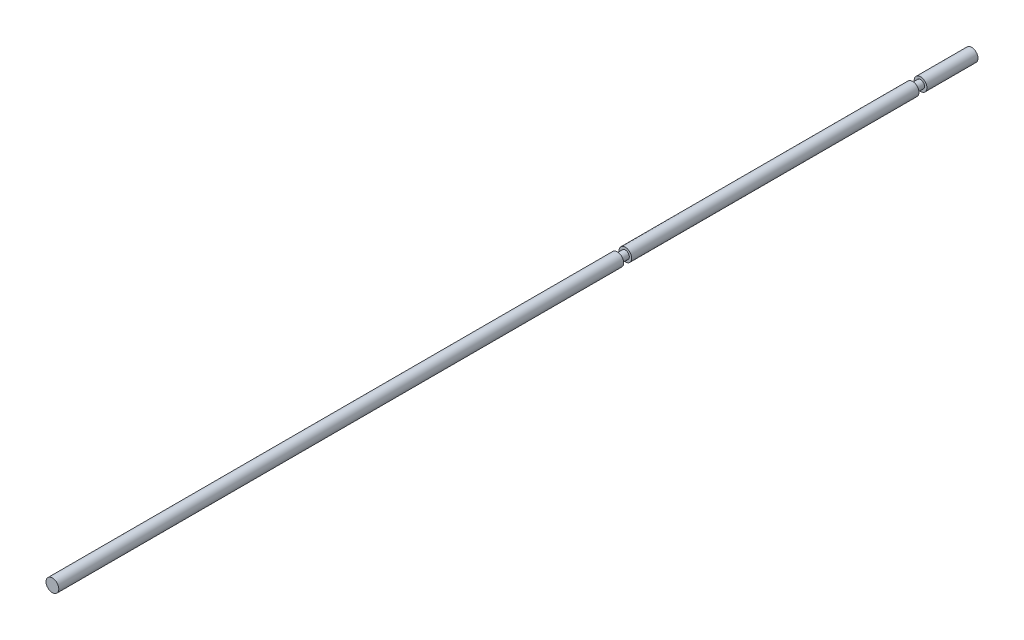
ISO-10303-21;
HEADER;
FILE_DESCRIPTION(('STEP AP214'),'2;1');
FILE_NAME('part.step','',(''),(''),'','','');
FILE_SCHEMA(('AUTOMOTIVE_DESIGN { 1 0 10303 214 1 1 1 1 }'));
ENDSEC;
DATA;
#1=APPLICATION_CONTEXT('core data for automotive mechanical design processes');
#2=APPLICATION_PROTOCOL_DEFINITION('international standard','automotive_design',2000,#1);
#3=PRODUCT_CONTEXT('',#1,'mechanical');
#4=PRODUCT('Part','Part','',(#3));
#5=PRODUCT_RELATED_PRODUCT_CATEGORY('part','',(#4));
#6=PRODUCT_DEFINITION_FORMATION('','',#4);
#7=PRODUCT_DEFINITION_CONTEXT('part definition',#1,'design');
#8=PRODUCT_DEFINITION('design','',#6,#7);
#9=PRODUCT_DEFINITION_SHAPE('','',#8);
#10=(LENGTH_UNIT() NAMED_UNIT(*) SI_UNIT(.MILLI.,.METRE.));
#11=(NAMED_UNIT(*) PLANE_ANGLE_UNIT() SI_UNIT($,.RADIAN.));
#12=(NAMED_UNIT(*) SI_UNIT($,.STERADIAN.) SOLID_ANGLE_UNIT());
#13=UNCERTAINTY_MEASURE_WITH_UNIT(LENGTH_MEASURE(1.E-05),#10,'distance_accuracy_value','');
#14=(GEOMETRIC_REPRESENTATION_CONTEXT(3) GLOBAL_UNCERTAINTY_ASSIGNED_CONTEXT((#13)) GLOBAL_UNIT_ASSIGNED_CONTEXT((#10,
#11,#12)) REPRESENTATION_CONTEXT('',''));
#15=CARTESIAN_POINT('',(0.,0.,0.));
#16=DIRECTION('',(0.,0.,1.));
#17=DIRECTION('',(1.,0.,0.));
#18=AXIS2_PLACEMENT_3D('',#15,#16,#17);
#19=CARTESIAN_POINT('',(0.,0.,914.4));
#20=DIRECTION('',(0.,0.,-1.));
#21=DIRECTION('',(-1.,0.,0.));
#22=AXIS2_PLACEMENT_3D('',#19,#20,#21);
#23=CYLINDRICAL_SURFACE('',#22,6.35);
#24=CARTESIAN_POINT('',(0.,0.,344.4875));
#25=DIRECTION('',(0.,0.,-1.));
#26=DIRECTION('',(-1.,0.,0.));
#27=AXIS2_PLACEMENT_3D('',#24,#25,#26);
#28=CIRCLE('',#27,6.35);
#29=CARTESIAN_POINT('',(-6.35,0.,344.4875));
#30=VERTEX_POINT('',#29);
#31=EDGE_CURVE('E56',#30,#30,#28,.T.);
#32=ORIENTED_EDGE('',*,*,#31,.T.);
#33=EDGE_LOOP('',(#32));
#34=FACE_BOUND('',#33,.T.);
#35=CARTESIAN_POINT('',(0.,0.,58.7375));
#36=DIRECTION('',(0.,0.,-1.));
#37=DIRECTION('',(-1.,0.,0.));
#38=AXIS2_PLACEMENT_3D('',#35,#36,#37);
#39=CIRCLE('',#38,6.35);
#40=CARTESIAN_POINT('',(-6.35,0.,58.7375));
#41=VERTEX_POINT('',#40);
#42=EDGE_CURVE('E42',#41,#41,#39,.T.);
#43=ORIENTED_EDGE('',*,*,#42,.F.);
#44=EDGE_LOOP('',(#43));
#45=FACE_BOUND('',#44,.T.);
#46=ADVANCED_FACE('F31',(#34,#45),#23,.T.);
#47=CARTESIAN_POINT('',(0.,0.,58.7375));
#48=DIRECTION('',(0.,0.,-1.));
#49=DIRECTION('',(-1.,0.,0.));
#50=AXIS2_PLACEMENT_3D('',#47,#48,#49);
#51=CYLINDRICAL_SURFACE('',#50,3.96875);
#52=CARTESIAN_POINT('',(0.,0.,58.7375));
#53=DIRECTION('',(0.,0.,-1.));
#54=DIRECTION('',(-1.,0.,0.));
#55=AXIS2_PLACEMENT_3D('',#52,#53,#54);
#56=CIRCLE('',#55,3.96875);
#57=CARTESIAN_POINT('',(-3.96875,0.,58.7375));
#58=VERTEX_POINT('',#57);
#59=EDGE_CURVE('E47',#58,#58,#56,.T.);
#60=ORIENTED_EDGE('',*,*,#59,.T.);
#61=EDGE_LOOP('',(#60));
#62=FACE_BOUND('',#61,.T.);
#63=CARTESIAN_POINT('',(0.,0.,50.8));
#64=DIRECTION('',(0.,0.,-1.));
#65=DIRECTION('',(-1.,0.,0.));
#66=AXIS2_PLACEMENT_3D('',#63,#64,#65);
#67=CIRCLE('',#66,3.96875);
#68=CARTESIAN_POINT('',(-3.96875,0.,50.8));
#69=VERTEX_POINT('',#68);
#70=EDGE_CURVE('E48',#69,#69,#67,.T.);
#71=ORIENTED_EDGE('',*,*,#70,.F.);
#72=EDGE_LOOP('',(#71));
#73=FACE_BOUND('',#72,.T.);
#74=ADVANCED_FACE('F87',(#62,#73),#51,.T.);
#75=CARTESIAN_POINT('',(0.,0.,58.7375));
#76=DIRECTION('',(0.,0.,-1.));
#77=DIRECTION('',(-1.,0.,0.));
#78=AXIS2_PLACEMENT_3D('',#75,#76,#77);
#79=PLANE('',#78);
#80=ORIENTED_EDGE('',*,*,#59,.F.);
#81=EDGE_LOOP('',(#80));
#82=FACE_BOUND('',#81,.T.);
#83=ORIENTED_EDGE('',*,*,#42,.T.);
#84=EDGE_LOOP('',(#83));
#85=FACE_BOUND('',#84,.T.);
#86=ADVANCED_FACE('F102',(#82,#85),#79,.T.);
#87=CARTESIAN_POINT('',(0.,0.,50.8));
#88=DIRECTION('',(0.,0.,-1.));
#89=DIRECTION('',(-1.,0.,0.));
#90=AXIS2_PLACEMENT_3D('',#87,#88,#89);
#91=PLANE('',#90);
#92=ORIENTED_EDGE('',*,*,#70,.T.);
#93=EDGE_LOOP('',(#92));
#94=FACE_BOUND('',#93,.T.);
#95=CARTESIAN_POINT('',(0.,0.,50.8));
#96=DIRECTION('',(0.,0.,-1.));
#97=DIRECTION('',(-1.,0.,0.));
#98=AXIS2_PLACEMENT_3D('',#95,#96,#97);
#99=CIRCLE('',#98,6.35);
#100=CARTESIAN_POINT('',(-6.35,0.,50.8));
#101=VERTEX_POINT('',#100);
#102=EDGE_CURVE('E44',#101,#101,#99,.T.);
#103=ORIENTED_EDGE('',*,*,#102,.F.);
#104=EDGE_LOOP('',(#103));
#105=FACE_BOUND('',#104,.T.);
#106=ADVANCED_FACE('F95',(#94,#105),#91,.F.);
#107=CARTESIAN_POINT('',(0.,0.,0.));
#108=DIRECTION('',(0.,0.,1.));
#109=DIRECTION('',(1.,0.,0.));
#110=AXIS2_PLACEMENT_3D('',#107,#108,#109);
#111=PLANE('',#110);
#112=CARTESIAN_POINT('',(0.,0.,0.));
#113=DIRECTION('',(0.,0.,1.));
#114=DIRECTION('',(1.,0.,0.));
#115=AXIS2_PLACEMENT_3D('',#112,#113,#114);
#116=CIRCLE('',#115,6.35);
#117=CARTESIAN_POINT('',(6.35,0.,0.));
#118=VERTEX_POINT('',#117);
#119=EDGE_CURVE('E35',#118,#118,#116,.T.);
#120=ORIENTED_EDGE('',*,*,#119,.F.);
#121=EDGE_LOOP('',(#120));
#122=FACE_BOUND('',#121,.T.);
#123=ADVANCED_FACE('F90',(#122),#111,.F.);
#124=ORIENTED_EDGE('',*,*,#102,.T.);
#125=EDGE_LOOP('',(#124));
#126=FACE_BOUND('',#125,.T.);
#127=ORIENTED_EDGE('',*,*,#119,.T.);
#128=EDGE_LOOP('',(#127));
#129=FACE_BOUND('',#128,.T.);
#130=ADVANCED_FACE('F33',(#126,#129),#23,.T.);
#131=CARTESIAN_POINT('',(0.,0.,352.425));
#132=DIRECTION('',(0.,0.,-1.));
#133=DIRECTION('',(-1.,0.,0.));
#134=AXIS2_PLACEMENT_3D('',#131,#132,#133);
#135=PLANE('',#134);
#136=CARTESIAN_POINT('',(0.,0.,352.425));
#137=DIRECTION('',(0.,0.,-1.));
#138=DIRECTION('',(-1.,0.,0.));
#139=AXIS2_PLACEMENT_3D('',#136,#137,#138);
#140=CIRCLE('',#139,3.96875);
#141=CARTESIAN_POINT('',(-3.96875,0.,352.425));
#142=VERTEX_POINT('',#141);
#143=EDGE_CURVE('E59',#142,#142,#140,.T.);
#144=ORIENTED_EDGE('',*,*,#143,.F.);
#145=EDGE_LOOP('',(#144));
#146=FACE_BOUND('',#145,.T.);
#147=CARTESIAN_POINT('',(0.,0.,352.425));
#148=DIRECTION('',(0.,0.,-1.));
#149=DIRECTION('',(-1.,0.,0.));
#150=AXIS2_PLACEMENT_3D('',#147,#148,#149);
#151=CIRCLE('',#150,6.35);
#152=CARTESIAN_POINT('',(-6.35,0.,352.425));
#153=VERTEX_POINT('',#152);
#154=EDGE_CURVE('E51',#153,#153,#151,.T.);
#155=ORIENTED_EDGE('',*,*,#154,.T.);
#156=EDGE_LOOP('',(#155));
#157=FACE_BOUND('',#156,.T.);
#158=ADVANCED_FACE('F71',(#146,#157),#135,.T.);
#159=CARTESIAN_POINT('',(0.,0.,344.4875));
#160=DIRECTION('',(0.,0.,-1.));
#161=DIRECTION('',(-1.,0.,0.));
#162=AXIS2_PLACEMENT_3D('',#159,#160,#161);
#163=PLANE('',#162);
#164=CARTESIAN_POINT('',(0.,0.,344.4875));
#165=DIRECTION('',(0.,0.,-1.));
#166=DIRECTION('',(-1.,0.,0.));
#167=AXIS2_PLACEMENT_3D('',#164,#165,#166);
#168=CIRCLE('',#167,3.96875);
#169=CARTESIAN_POINT('',(-3.96875,0.,344.4875));
#170=VERTEX_POINT('',#169);
#171=EDGE_CURVE('E62',#170,#170,#168,.T.);
#172=ORIENTED_EDGE('',*,*,#171,.T.);
#173=EDGE_LOOP('',(#172));
#174=FACE_BOUND('',#173,.T.);
#175=ORIENTED_EDGE('',*,*,#31,.F.);
#176=EDGE_LOOP('',(#175));
#177=FACE_BOUND('',#176,.T.);
#178=ADVANCED_FACE('F74',(#174,#177),#163,.F.);
#179=CARTESIAN_POINT('',(0.,0.,352.425));
#180=DIRECTION('',(0.,0.,-1.));
#181=DIRECTION('',(-1.,0.,0.));
#182=AXIS2_PLACEMENT_3D('',#179,#180,#181);
#183=CYLINDRICAL_SURFACE('',#182,3.96875);
#184=ORIENTED_EDGE('',*,*,#143,.T.);
#185=EDGE_LOOP('',(#184));
#186=FACE_BOUND('',#185,.T.);
#187=ORIENTED_EDGE('',*,*,#171,.F.);
#188=EDGE_LOOP('',(#187));
#189=FACE_BOUND('',#188,.T.);
#190=ADVANCED_FACE('F68',(#186,#189),#183,.T.);
#191=CARTESIAN_POINT('',(0.,0.,914.4));
#192=DIRECTION('',(0.,0.,1.));
#193=DIRECTION('',(1.,0.,0.));
#194=AXIS2_PLACEMENT_3D('',#191,#192,#193);
#195=PLANE('',#194);
#196=CARTESIAN_POINT('',(0.,0.,914.4));
#197=DIRECTION('',(0.,0.,1.));
#198=DIRECTION('',(1.,0.,0.));
#199=AXIS2_PLACEMENT_3D('',#196,#197,#198);
#200=CIRCLE('',#199,6.35);
#201=CARTESIAN_POINT('',(6.35,0.,914.4));
#202=VERTEX_POINT('',#201);
#203=EDGE_CURVE('E10',#202,#202,#200,.T.);
#204=ORIENTED_EDGE('',*,*,#203,.T.);
#205=EDGE_LOOP('',(#204));
#206=FACE_BOUND('',#205,.T.);
#207=ADVANCED_FACE('F80',(#206),#195,.T.);
#208=ORIENTED_EDGE('',*,*,#203,.F.);
#209=EDGE_LOOP('',(#208));
#210=FACE_BOUND('',#209,.T.);
#211=ORIENTED_EDGE('',*,*,#154,.F.);
#212=EDGE_LOOP('',(#211));
#213=FACE_BOUND('',#212,.T.);
#214=ADVANCED_FACE('F78',(#210,#213),#23,.T.);
#215=CLOSED_SHELL('',(#46,#74,#86,#106,#123,#130,#158,#178,#190,#207,#214));
#216=MANIFOLD_SOLID_BREP('B2',#215);
#217=ADVANCED_BREP_SHAPE_REPRESENTATION('',(#18,#216),#14);
#218=SHAPE_DEFINITION_REPRESENTATION(#9,#217);
ENDSEC;
END-ISO-10303-21;
